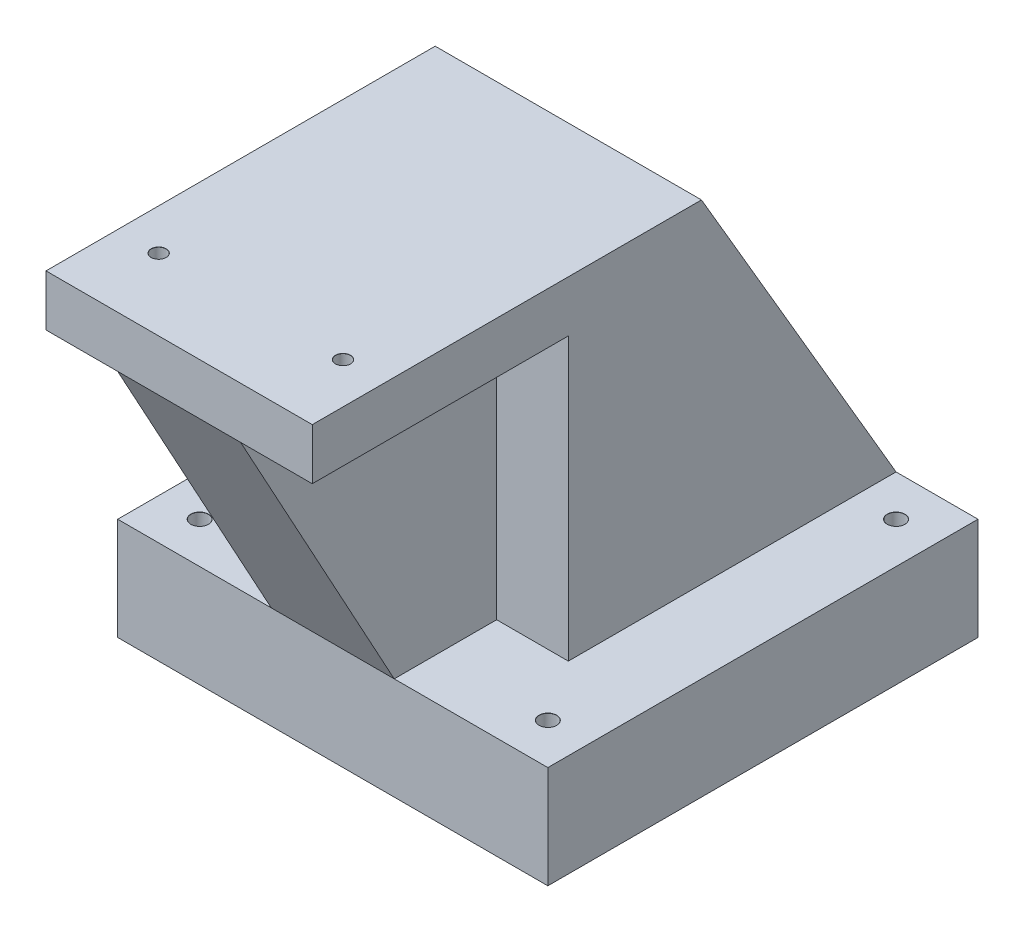
ISO-10303-21;
HEADER;
FILE_DESCRIPTION(('STEP AP214'),'2;1');
FILE_NAME('part.step','',(''),(''),'','','');
FILE_SCHEMA(('AUTOMOTIVE_DESIGN { 1 0 10303 214 1 1 1 1 }'));
ENDSEC;
DATA;
#1=APPLICATION_CONTEXT('core data for automotive mechanical design processes');
#2=APPLICATION_PROTOCOL_DEFINITION('international standard','automotive_design',2000,#1);
#3=PRODUCT_CONTEXT('',#1,'mechanical');
#4=PRODUCT('Part','Part','',(#3));
#5=PRODUCT_RELATED_PRODUCT_CATEGORY('part','',(#4));
#6=PRODUCT_DEFINITION_FORMATION('','',#4);
#7=PRODUCT_DEFINITION_CONTEXT('part definition',#1,'design');
#8=PRODUCT_DEFINITION('design','',#6,#7);
#9=PRODUCT_DEFINITION_SHAPE('','',#8);
#10=(LENGTH_UNIT() NAMED_UNIT(*) SI_UNIT(.MILLI.,.METRE.));
#11=(NAMED_UNIT(*) PLANE_ANGLE_UNIT() SI_UNIT($,.RADIAN.));
#12=(NAMED_UNIT(*) SI_UNIT($,.STERADIAN.) SOLID_ANGLE_UNIT());
#13=UNCERTAINTY_MEASURE_WITH_UNIT(LENGTH_MEASURE(1.E-05),#10,'distance_accuracy_value','');
#14=(GEOMETRIC_REPRESENTATION_CONTEXT(3) GLOBAL_UNCERTAINTY_ASSIGNED_CONTEXT((#13)) GLOBAL_UNIT_ASSIGNED_CONTEXT((#10,
#11,#12)) REPRESENTATION_CONTEXT('',''));
#15=CARTESIAN_POINT('',(0.,0.,0.));
#16=DIRECTION('',(0.,0.,1.));
#17=DIRECTION('',(1.,0.,0.));
#18=AXIS2_PLACEMENT_3D('',#15,#16,#17);
#19=CARTESIAN_POINT('',(0.,20.,0.));
#20=DIRECTION('',(0.,1.,0.));
#21=DIRECTION('',(0.,0.,1.));
#22=AXIS2_PLACEMENT_3D('',#19,#20,#21);
#23=PLANE('',#22);
#24=DIRECTION('',(0.,0.,1.));
#25=VECTOR('',#24,1.);
#26=CARTESIAN_POINT('',(-42.,20.,-42.));
#27=LINE('',#26,#25);
#28=CARTESIAN_POINT('',(-42.,20.,-42.));
#29=VERTEX_POINT('',#28);
#30=CARTESIAN_POINT('',(-42.,20.,42.));
#31=VERTEX_POINT('',#30);
#32=EDGE_CURVE('E237',#29,#31,#27,.T.);
#33=ORIENTED_EDGE('',*,*,#32,.T.);
#34=DIRECTION('',(1.,0.,0.));
#35=VECTOR('',#34,1.);
#36=CARTESIAN_POINT('',(-42.,20.,42.));
#37=LINE('',#36,#35);
#38=CARTESIAN_POINT('',(-12.,20.,42.));
#39=VERTEX_POINT('',#38);
#40=EDGE_CURVE('E105',#31,#39,#37,.T.);
#41=ORIENTED_EDGE('',*,*,#40,.T.);
#42=DIRECTION('',(0.,0.,1.));
#43=VECTOR('',#42,1.);
#44=CARTESIAN_POINT('',(-12.,20.,22.));
#45=LINE('',#44,#43);
#46=CARTESIAN_POINT('',(-12.,20.,22.));
#47=VERTEX_POINT('',#46);
#48=EDGE_CURVE('E171',#47,#39,#45,.T.);
#49=ORIENTED_EDGE('',*,*,#48,.F.);
#50=DIRECTION('',(1.,0.,0.));
#51=VECTOR('',#50,1.);
#52=CARTESIAN_POINT('',(-42.,20.,22.));
#53=LINE('',#52,#51);
#54=CARTESIAN_POINT('',(-26.,20.,22.));
#55=VERTEX_POINT('',#54);
#56=EDGE_CURVE('E161',#55,#47,#53,.T.);
#57=ORIENTED_EDGE('',*,*,#56,.F.);
#58=DIRECTION('',(0.,0.,1.));
#59=VECTOR('',#58,1.);
#60=CARTESIAN_POINT('',(-26.,20.,-4.));
#61=LINE('',#60,#59);
#62=CARTESIAN_POINT('',(-26.,20.,-42.));
#63=VERTEX_POINT('',#62);
#64=EDGE_CURVE('E202',#63,#55,#61,.T.);
#65=ORIENTED_EDGE('',*,*,#64,.F.);
#66=DIRECTION('',(-1.,0.,0.));
#67=VECTOR('',#66,1.);
#68=CARTESIAN_POINT('',(-42.,20.,-42.));
#69=LINE('',#68,#67);
#70=EDGE_CURVE('E64',#63,#29,#69,.T.);
#71=ORIENTED_EDGE('',*,*,#70,.T.);
#72=EDGE_LOOP('',(#33,#41,#49,#57,#65,#71));
#73=FACE_BOUND('',#72,.T.);
#74=CARTESIAN_POINT('',(-34.,20.,-34.));
#75=DIRECTION('',(0.,1.,0.));
#76=DIRECTION('',(0.,0.,1.));
#77=AXIS2_PLACEMENT_3D('',#74,#75,#76);
#78=CIRCLE('',#77,1.725);
#79=CARTESIAN_POINT('',(-34.,20.,-32.275));
#80=VERTEX_POINT('',#79);
#81=EDGE_CURVE('E201',#80,#80,#78,.T.);
#82=ORIENTED_EDGE('',*,*,#81,.F.);
#83=EDGE_LOOP('',(#82));
#84=FACE_BOUND('',#83,.T.);
#85=CARTESIAN_POINT('',(-34.,20.,34.));
#86=DIRECTION('',(0.,1.,0.));
#87=DIRECTION('',(0.,0.,1.));
#88=AXIS2_PLACEMENT_3D('',#85,#86,#87);
#89=CIRCLE('',#88,1.725);
#90=CARTESIAN_POINT('',(-34.,20.,35.725));
#91=VERTEX_POINT('',#90);
#92=EDGE_CURVE('E184',#91,#91,#89,.T.);
#93=ORIENTED_EDGE('',*,*,#92,.F.);
#94=EDGE_LOOP('',(#93));
#95=FACE_BOUND('',#94,.T.);
#96=ADVANCED_FACE('F40',(#73,#84,#95),#23,.T.);
#97=CARTESIAN_POINT('',(42.,20.,-42.));
#98=DIRECTION('',(-1.,0.,0.));
#99=DIRECTION('',(0.,0.,1.));
#100=AXIS2_PLACEMENT_3D('',#97,#98,#99);
#101=PLANE('',#100);
#102=DIRECTION('',(0.,0.,-1.));
#103=VECTOR('',#102,1.);
#104=CARTESIAN_POINT('',(42.,20.,-42.));
#105=LINE('',#104,#103);
#106=CARTESIAN_POINT('',(42.,20.,42.));
#107=VERTEX_POINT('',#106);
#108=CARTESIAN_POINT('',(42.,20.,-42.));
#109=VERTEX_POINT('',#108);
#110=EDGE_CURVE('E96',#107,#109,#105,.T.);
#111=ORIENTED_EDGE('',*,*,#110,.F.);
#112=DIRECTION('',(0.,-1.,0.));
#113=VECTOR('',#112,1.);
#114=CARTESIAN_POINT('',(42.,20.,42.));
#115=LINE('',#114,#113);
#116=CARTESIAN_POINT('',(42.,0.,42.));
#117=VERTEX_POINT('',#116);
#118=EDGE_CURVE('E89',#107,#117,#115,.T.);
#119=ORIENTED_EDGE('',*,*,#118,.T.);
#120=DIRECTION('',(0.,0.,-1.));
#121=VECTOR('',#120,1.);
#122=CARTESIAN_POINT('',(42.,0.,-42.));
#123=LINE('',#122,#121);
#124=CARTESIAN_POINT('',(42.,0.,-42.));
#125=VERTEX_POINT('',#124);
#126=EDGE_CURVE('E103',#117,#125,#123,.T.);
#127=ORIENTED_EDGE('',*,*,#126,.T.);
#128=DIRECTION('',(0.,-1.,0.));
#129=VECTOR('',#128,1.);
#130=CARTESIAN_POINT('',(42.,20.,-42.));
#131=LINE('',#130,#129);
#132=EDGE_CURVE('E124',#109,#125,#131,.T.);
#133=ORIENTED_EDGE('',*,*,#132,.F.);
#134=EDGE_LOOP('',(#111,#119,#127,#133));
#135=FACE_BOUND('',#134,.T.);
#136=ADVANCED_FACE('F42',(#135),#101,.F.);
#137=CARTESIAN_POINT('',(-42.,20.,-42.));
#138=DIRECTION('',(0.,0.,1.));
#139=DIRECTION('',(1.,0.,0.));
#140=AXIS2_PLACEMENT_3D('',#137,#138,#139);
#141=PLANE('',#140);
#142=ORIENTED_EDGE('',*,*,#70,.F.);
#143=DIRECTION('',(1.,0.,0.));
#144=VECTOR('',#143,1.);
#145=CARTESIAN_POINT('',(-204.,20.,-42.));
#146=LINE('',#145,#144);
#147=CARTESIAN_POINT('',(26.,20.,-42.));
#148=VERTEX_POINT('',#147);
#149=EDGE_CURVE('E326',#63,#148,#146,.T.);
#150=ORIENTED_EDGE('',*,*,#149,.T.);
#151=EDGE_CURVE('E236',#109,#148,#69,.T.);
#152=ORIENTED_EDGE('',*,*,#151,.F.);
#153=ORIENTED_EDGE('',*,*,#132,.T.);
#154=DIRECTION('',(-1.,0.,0.));
#155=VECTOR('',#154,1.);
#156=CARTESIAN_POINT('',(-42.,0.,-42.));
#157=LINE('',#156,#155);
#158=CARTESIAN_POINT('',(-42.,0.,-42.));
#159=VERTEX_POINT('',#158);
#160=EDGE_CURVE('E108',#125,#159,#157,.T.);
#161=ORIENTED_EDGE('',*,*,#160,.T.);
#162=DIRECTION('',(0.,-1.,0.));
#163=VECTOR('',#162,1.);
#164=CARTESIAN_POINT('',(-42.,20.,-42.));
#165=LINE('',#164,#163);
#166=EDGE_CURVE('E121',#29,#159,#165,.T.);
#167=ORIENTED_EDGE('',*,*,#166,.F.);
#168=EDGE_LOOP('',(#142,#150,#152,#153,#161,#167));
#169=FACE_BOUND('',#168,.T.);
#170=ADVANCED_FACE('F375',(#169),#141,.F.);
#171=CARTESIAN_POINT('',(-42.,20.,-42.));
#172=DIRECTION('',(1.,0.,0.));
#173=DIRECTION('',(0.,0.,-1.));
#174=AXIS2_PLACEMENT_3D('',#171,#172,#173);
#175=PLANE('',#174);
#176=DIRECTION('',(0.,-1.,0.));
#177=VECTOR('',#176,1.);
#178=CARTESIAN_POINT('',(-42.,20.,42.));
#179=LINE('',#178,#177);
#180=CARTESIAN_POINT('',(-42.,0.,42.));
#181=VERTEX_POINT('',#180);
#182=EDGE_CURVE('E92',#31,#181,#179,.T.);
#183=ORIENTED_EDGE('',*,*,#182,.F.);
#184=ORIENTED_EDGE('',*,*,#32,.F.);
#185=ORIENTED_EDGE('',*,*,#166,.T.);
#186=DIRECTION('',(0.,0.,1.));
#187=VECTOR('',#186,1.);
#188=CARTESIAN_POINT('',(-42.,0.,-42.));
#189=LINE('',#188,#187);
#190=EDGE_CURVE('E97',#159,#181,#189,.T.);
#191=ORIENTED_EDGE('',*,*,#190,.T.);
#192=EDGE_LOOP('',(#183,#184,#185,#191));
#193=FACE_BOUND('',#192,.T.);
#194=ADVANCED_FACE('F385',(#193),#175,.F.);
#195=CARTESIAN_POINT('',(-42.,20.,42.));
#196=DIRECTION('',(0.,0.,-1.));
#197=DIRECTION('',(-1.,0.,0.));
#198=AXIS2_PLACEMENT_3D('',#195,#196,#197);
#199=PLANE('',#198);
#200=DIRECTION('',(1.,0.,0.));
#201=VECTOR('',#200,1.);
#202=CARTESIAN_POINT('',(-42.,0.,42.));
#203=LINE('',#202,#201);
#204=EDGE_CURVE('E85',#181,#117,#203,.T.);
#205=ORIENTED_EDGE('',*,*,#204,.T.);
#206=ORIENTED_EDGE('',*,*,#118,.F.);
#207=CARTESIAN_POINT('',(12.,20.,42.));
#208=VERTEX_POINT('',#207);
#209=EDGE_CURVE('E238',#208,#107,#37,.T.);
#210=ORIENTED_EDGE('',*,*,#209,.F.);
#211=EDGE_CURVE('E242',#39,#208,#37,.T.);
#212=ORIENTED_EDGE('',*,*,#211,.F.);
#213=ORIENTED_EDGE('',*,*,#40,.F.);
#214=ORIENTED_EDGE('',*,*,#182,.T.);
#215=EDGE_LOOP('',(#205,#206,#210,#212,#213,#214));
#216=FACE_BOUND('',#215,.T.);
#217=ADVANCED_FACE('F87',(#216),#199,.F.);
#218=DIRECTION('',(0.,0.,-1.));
#219=VECTOR('',#218,1.);
#220=CARTESIAN_POINT('',(26.,20.,-4.));
#221=LINE('',#220,#219);
#222=CARTESIAN_POINT('',(26.,20.,22.));
#223=VERTEX_POINT('',#222);
#224=EDGE_CURVE('E55',#223,#148,#221,.T.);
#225=ORIENTED_EDGE('',*,*,#224,.F.);
#226=DIRECTION('',(1.,0.,0.));
#227=VECTOR('',#226,1.);
#228=CARTESIAN_POINT('',(42.,20.,22.));
#229=LINE('',#228,#227);
#230=CARTESIAN_POINT('',(12.,20.,22.));
#231=VERTEX_POINT('',#230);
#232=EDGE_CURVE('E140',#231,#223,#229,.T.);
#233=ORIENTED_EDGE('',*,*,#232,.F.);
#234=DIRECTION('',(0.,0.,1.));
#235=VECTOR('',#234,1.);
#236=CARTESIAN_POINT('',(12.,20.,22.));
#237=LINE('',#236,#235);
#238=EDGE_CURVE('E149',#231,#208,#237,.T.);
#239=ORIENTED_EDGE('',*,*,#238,.T.);
#240=ORIENTED_EDGE('',*,*,#209,.T.);
#241=ORIENTED_EDGE('',*,*,#110,.T.);
#242=ORIENTED_EDGE('',*,*,#151,.T.);
#243=EDGE_LOOP('',(#225,#233,#239,#240,#241,#242));
#244=FACE_BOUND('',#243,.T.);
#245=CARTESIAN_POINT('',(34.,20.,-34.));
#246=DIRECTION('',(0.,1.,0.));
#247=DIRECTION('',(0.,0.,1.));
#248=AXIS2_PLACEMENT_3D('',#245,#246,#247);
#249=CIRCLE('',#248,1.725);
#250=CARTESIAN_POINT('',(34.,20.,-32.275));
#251=VERTEX_POINT('',#250);
#252=EDGE_CURVE('E214',#251,#251,#249,.T.);
#253=ORIENTED_EDGE('',*,*,#252,.F.);
#254=EDGE_LOOP('',(#253));
#255=FACE_BOUND('',#254,.T.);
#256=CARTESIAN_POINT('',(34.,20.,34.));
#257=DIRECTION('',(0.,1.,0.));
#258=DIRECTION('',(0.,0.,1.));
#259=AXIS2_PLACEMENT_3D('',#256,#257,#258);
#260=CIRCLE('',#259,1.725);
#261=CARTESIAN_POINT('',(34.,20.,35.725));
#262=VERTEX_POINT('',#261);
#263=EDGE_CURVE('E189',#262,#262,#260,.T.);
#264=ORIENTED_EDGE('',*,*,#263,.F.);
#265=EDGE_LOOP('',(#264));
#266=FACE_BOUND('',#265,.T.);
#267=ADVANCED_FACE('F346',(#244,#255,#266),#23,.T.);
#268=CARTESIAN_POINT('',(0.,0.,0.));
#269=DIRECTION('',(0.,1.,0.));
#270=DIRECTION('',(0.,0.,1.));
#271=AXIS2_PLACEMENT_3D('',#268,#269,#270);
#272=PLANE('',#271);
#273=CARTESIAN_POINT('',(-34.,0.,-34.));
#274=DIRECTION('',(0.,1.,0.));
#275=DIRECTION('',(0.,0.,1.));
#276=AXIS2_PLACEMENT_3D('',#273,#274,#275);
#277=CIRCLE('',#276,1.69999999999999);
#278=CARTESIAN_POINT('',(-34.,0.,-32.3));
#279=VERTEX_POINT('',#278);
#280=EDGE_CURVE('E211',#279,#279,#277,.T.);
#281=ORIENTED_EDGE('',*,*,#280,.T.);
#282=EDGE_LOOP('',(#281));
#283=FACE_BOUND('',#282,.T.);
#284=CARTESIAN_POINT('',(34.,0.,-34.));
#285=DIRECTION('',(0.,1.,0.));
#286=DIRECTION('',(0.,0.,1.));
#287=AXIS2_PLACEMENT_3D('',#284,#285,#286);
#288=CIRCLE('',#287,1.69999999999999);
#289=CARTESIAN_POINT('',(34.,0.,-32.3));
#290=VERTEX_POINT('',#289);
#291=EDGE_CURVE('E220',#290,#290,#288,.T.);
#292=ORIENTED_EDGE('',*,*,#291,.T.);
#293=EDGE_LOOP('',(#292));
#294=FACE_BOUND('',#293,.T.);
#295=CARTESIAN_POINT('',(34.,0.,34.));
#296=DIRECTION('',(0.,1.,0.));
#297=DIRECTION('',(0.,0.,1.));
#298=AXIS2_PLACEMENT_3D('',#295,#296,#297);
#299=CIRCLE('',#298,1.69999999999999);
#300=CARTESIAN_POINT('',(34.,0.,35.7));
#301=VERTEX_POINT('',#300);
#302=EDGE_CURVE('E228',#301,#301,#299,.T.);
#303=ORIENTED_EDGE('',*,*,#302,.T.);
#304=EDGE_LOOP('',(#303));
#305=FACE_BOUND('',#304,.T.);
#306=CARTESIAN_POINT('',(-34.,0.,34.));
#307=DIRECTION('',(0.,1.,0.));
#308=DIRECTION('',(0.,0.,1.));
#309=AXIS2_PLACEMENT_3D('',#306,#307,#308);
#310=CIRCLE('',#309,1.69999999999999);
#311=CARTESIAN_POINT('',(-34.,0.,35.7));
#312=VERTEX_POINT('',#311);
#313=EDGE_CURVE('E110',#312,#312,#310,.T.);
#314=ORIENTED_EDGE('',*,*,#313,.T.);
#315=EDGE_LOOP('',(#314));
#316=FACE_BOUND('',#315,.T.);
#317=ORIENTED_EDGE('',*,*,#126,.F.);
#318=ORIENTED_EDGE('',*,*,#204,.F.);
#319=ORIENTED_EDGE('',*,*,#190,.F.);
#320=ORIENTED_EDGE('',*,*,#160,.F.);
#321=EDGE_LOOP('',(#317,#318,#319,#320));
#322=FACE_BOUND('',#321,.T.);
#323=ADVANCED_FACE('F107',(#283,#294,#305,#316,#322),#272,.F.);
#324=CARTESIAN_POINT('',(-34.,20.,34.));
#325=DIRECTION('',(0.,1.,0.));
#326=DIRECTION('',(0.,0.,1.));
#327=AXIS2_PLACEMENT_3D('',#324,#325,#326);
#328=CYLINDRICAL_SURFACE('',#327,1.69999999999999);
#329=ORIENTED_EDGE('',*,*,#313,.F.);
#330=EDGE_LOOP('',(#329));
#331=FACE_BOUND('',#330,.T.);
#332=CARTESIAN_POINT('',(-34.,19.975,34.));
#333=DIRECTION('',(0.,1.,0.));
#334=DIRECTION('',(0.,0.,1.));
#335=AXIS2_PLACEMENT_3D('',#332,#333,#334);
#336=CIRCLE('',#335,1.69999999999999);
#337=CARTESIAN_POINT('',(-34.,19.975,35.7));
#338=VERTEX_POINT('',#337);
#339=EDGE_CURVE('E114',#338,#338,#336,.T.);
#340=ORIENTED_EDGE('',*,*,#339,.T.);
#341=EDGE_LOOP('',(#340));
#342=FACE_BOUND('',#341,.T.);
#343=ADVANCED_FACE('F378',(#331,#342),#328,.F.);
#344=CARTESIAN_POINT('',(-34.,20.,34.));
#345=DIRECTION('',(0.,1.,0.));
#346=DIRECTION('',(0.,0.,1.));
#347=AXIS2_PLACEMENT_3D('',#344,#345,#346);
#348=CONICAL_SURFACE('',#347,1.725,0.785398163397101);
#349=ORIENTED_EDGE('',*,*,#339,.F.);
#350=EDGE_LOOP('',(#349));
#351=FACE_BOUND('',#350,.T.);
#352=ORIENTED_EDGE('',*,*,#92,.T.);
#353=EDGE_LOOP('',(#352));
#354=FACE_BOUND('',#353,.T.);
#355=ADVANCED_FACE('F367',(#351,#354),#348,.F.);
#356=CARTESIAN_POINT('',(34.,20.,34.));
#357=DIRECTION('',(0.,1.,0.));
#358=DIRECTION('',(0.,0.,1.));
#359=AXIS2_PLACEMENT_3D('',#356,#357,#358);
#360=CYLINDRICAL_SURFACE('',#359,1.69999999999999);
#361=ORIENTED_EDGE('',*,*,#302,.F.);
#362=EDGE_LOOP('',(#361));
#363=FACE_BOUND('',#362,.T.);
#364=CARTESIAN_POINT('',(34.,19.975,34.));
#365=DIRECTION('',(0.,1.,0.));
#366=DIRECTION('',(0.,0.,1.));
#367=AXIS2_PLACEMENT_3D('',#364,#365,#366);
#368=CIRCLE('',#367,1.69999999999999);
#369=CARTESIAN_POINT('',(34.,19.975,35.7));
#370=VERTEX_POINT('',#369);
#371=EDGE_CURVE('E223',#370,#370,#368,.T.);
#372=ORIENTED_EDGE('',*,*,#371,.T.);
#373=EDGE_LOOP('',(#372));
#374=FACE_BOUND('',#373,.T.);
#375=ADVANCED_FACE('F357',(#363,#374),#360,.F.);
#376=CARTESIAN_POINT('',(34.,20.,34.));
#377=DIRECTION('',(0.,1.,0.));
#378=DIRECTION('',(0.,0.,1.));
#379=AXIS2_PLACEMENT_3D('',#376,#377,#378);
#380=CONICAL_SURFACE('',#379,1.725,0.785398163397101);
#381=ORIENTED_EDGE('',*,*,#371,.F.);
#382=EDGE_LOOP('',(#381));
#383=FACE_BOUND('',#382,.T.);
#384=ORIENTED_EDGE('',*,*,#263,.T.);
#385=EDGE_LOOP('',(#384));
#386=FACE_BOUND('',#385,.T.);
#387=ADVANCED_FACE('F354',(#383,#386),#380,.F.);
#388=CARTESIAN_POINT('',(34.,20.,-34.));
#389=DIRECTION('',(0.,1.,0.));
#390=DIRECTION('',(0.,0.,1.));
#391=AXIS2_PLACEMENT_3D('',#388,#389,#390);
#392=CYLINDRICAL_SURFACE('',#391,1.69999999999999);
#393=ORIENTED_EDGE('',*,*,#291,.F.);
#394=EDGE_LOOP('',(#393));
#395=FACE_BOUND('',#394,.T.);
#396=CARTESIAN_POINT('',(34.,19.975,-34.));
#397=DIRECTION('',(0.,1.,0.));
#398=DIRECTION('',(0.,0.,1.));
#399=AXIS2_PLACEMENT_3D('',#396,#397,#398);
#400=CIRCLE('',#399,1.69999999999999);
#401=CARTESIAN_POINT('',(34.,19.975,-32.3));
#402=VERTEX_POINT('',#401);
#403=EDGE_CURVE('E217',#402,#402,#400,.T.);
#404=ORIENTED_EDGE('',*,*,#403,.T.);
#405=EDGE_LOOP('',(#404));
#406=FACE_BOUND('',#405,.T.);
#407=ADVANCED_FACE('F356',(#395,#406),#392,.F.);
#408=CARTESIAN_POINT('',(34.,20.,-34.));
#409=DIRECTION('',(0.,1.,0.));
#410=DIRECTION('',(0.,0.,1.));
#411=AXIS2_PLACEMENT_3D('',#408,#409,#410);
#412=CONICAL_SURFACE('',#411,1.725,0.78539816339724);
#413=ORIENTED_EDGE('',*,*,#403,.F.);
#414=EDGE_LOOP('',(#413));
#415=FACE_BOUND('',#414,.T.);
#416=ORIENTED_EDGE('',*,*,#252,.T.);
#417=EDGE_LOOP('',(#416));
#418=FACE_BOUND('',#417,.T.);
#419=ADVANCED_FACE('F364',(#415,#418),#412,.F.);
#420=CARTESIAN_POINT('',(-34.,20.,-34.));
#421=DIRECTION('',(0.,1.,0.));
#422=DIRECTION('',(0.,0.,1.));
#423=AXIS2_PLACEMENT_3D('',#420,#421,#422);
#424=CYLINDRICAL_SURFACE('',#423,1.69999999999999);
#425=ORIENTED_EDGE('',*,*,#280,.F.);
#426=EDGE_LOOP('',(#425));
#427=FACE_BOUND('',#426,.T.);
#428=CARTESIAN_POINT('',(-34.,19.975,-34.));
#429=DIRECTION('',(0.,1.,0.));
#430=DIRECTION('',(0.,0.,1.));
#431=AXIS2_PLACEMENT_3D('',#428,#429,#430);
#432=CIRCLE('',#431,1.69999999999999);
#433=CARTESIAN_POINT('',(-34.,19.975,-32.3));
#434=VERTEX_POINT('',#433);
#435=EDGE_CURVE('E208',#434,#434,#432,.T.);
#436=ORIENTED_EDGE('',*,*,#435,.T.);
#437=EDGE_LOOP('',(#436));
#438=FACE_BOUND('',#437,.T.);
#439=ADVANCED_FACE('F425',(#427,#438),#424,.F.);
#440=CARTESIAN_POINT('',(-34.,20.,-34.));
#441=DIRECTION('',(0.,1.,0.));
#442=DIRECTION('',(0.,0.,1.));
#443=AXIS2_PLACEMENT_3D('',#440,#441,#442);
#444=CONICAL_SURFACE('',#443,1.725,0.78539816339724);
#445=ORIENTED_EDGE('',*,*,#435,.F.);
#446=EDGE_LOOP('',(#445));
#447=FACE_BOUND('',#446,.T.);
#448=ORIENTED_EDGE('',*,*,#81,.T.);
#449=EDGE_LOOP('',(#448));
#450=FACE_BOUND('',#449,.T.);
#451=ADVANCED_FACE('F416',(#447,#450),#444,.F.);
#452=CARTESIAN_POINT('',(0.,85.,0.));
#453=DIRECTION('',(0.,1.,0.));
#454=DIRECTION('',(0.,0.,1.));
#455=AXIS2_PLACEMENT_3D('',#452,#453,#454);
#456=PLANE('',#455);
#457=DIRECTION('',(0.,0.,-1.));
#458=VECTOR('',#457,1.);
#459=CARTESIAN_POINT('',(26.,85.,226.));
#460=LINE('',#459,#458);
#461=CARTESIAN_POINT('',(26.,85.,72.));
#462=VERTEX_POINT('',#461);
#463=CARTESIAN_POINT('',(26.,85.,-4.));
#464=VERTEX_POINT('',#463);
#465=EDGE_CURVE('E309',#462,#464,#460,.T.);
#466=ORIENTED_EDGE('',*,*,#465,.T.);
#467=DIRECTION('',(1.,0.,0.));
#468=VECTOR('',#467,1.);
#469=CARTESIAN_POINT('',(-204.,85.,-4.));
#470=LINE('',#469,#468);
#471=CARTESIAN_POINT('',(-26.,85.,-4.));
#472=VERTEX_POINT('',#471);
#473=EDGE_CURVE('E314',#472,#464,#470,.T.);
#474=ORIENTED_EDGE('',*,*,#473,.F.);
#475=DIRECTION('',(0.,0.,-1.));
#476=VECTOR('',#475,1.);
#477=CARTESIAN_POINT('',(-26.,85.,226.));
#478=LINE('',#477,#476);
#479=CARTESIAN_POINT('',(-26.,85.,72.));
#480=VERTEX_POINT('',#479);
#481=EDGE_CURVE('E317',#480,#472,#478,.T.);
#482=ORIENTED_EDGE('',*,*,#481,.F.);
#483=DIRECTION('',(1.,0.,0.));
#484=VECTOR('',#483,1.);
#485=CARTESIAN_POINT('',(-42.,85.,72.));
#486=LINE('',#485,#484);
#487=EDGE_CURVE('E198',#480,#462,#486,.T.);
#488=ORIENTED_EDGE('',*,*,#487,.T.);
#489=EDGE_LOOP('',(#466,#474,#482,#488));
#490=FACE_BOUND('',#489,.T.);
#491=CARTESIAN_POINT('',(-18.,85.,58.));
#492=DIRECTION('',(0.,1.,0.));
#493=DIRECTION('',(0.,0.,1.));
#494=AXIS2_PLACEMENT_3D('',#491,#492,#493);
#495=CIRCLE('',#494,1.475);
#496=CARTESIAN_POINT('',(-18.,85.,59.475));
#497=VERTEX_POINT('',#496);
#498=EDGE_CURVE('E185',#497,#497,#495,.T.);
#499=ORIENTED_EDGE('',*,*,#498,.F.);
#500=EDGE_LOOP('',(#499));
#501=FACE_BOUND('',#500,.T.);
#502=CARTESIAN_POINT('',(18.,85.,58.));
#503=DIRECTION('',(0.,1.,0.));
#504=DIRECTION('',(0.,0.,1.));
#505=AXIS2_PLACEMENT_3D('',#502,#503,#504);
#506=CIRCLE('',#505,1.475);
#507=CARTESIAN_POINT('',(18.,85.,59.475));
#508=VERTEX_POINT('',#507);
#509=EDGE_CURVE('E192',#508,#508,#506,.T.);
#510=ORIENTED_EDGE('',*,*,#509,.F.);
#511=EDGE_LOOP('',(#510));
#512=FACE_BOUND('',#511,.T.);
#513=ADVANCED_FACE('F311',(#490,#501,#512),#456,.T.);
#514=CARTESIAN_POINT('',(-42.,85.,72.));
#515=DIRECTION('',(0.,0.,-1.));
#516=DIRECTION('',(-1.,0.,0.));
#517=AXIS2_PLACEMENT_3D('',#514,#515,#516);
#518=PLANE('',#517);
#519=DIRECTION('',(-1.,0.,0.));
#520=VECTOR('',#519,1.);
#521=CARTESIAN_POINT('',(42.,75.,72.));
#522=LINE('',#521,#520);
#523=CARTESIAN_POINT('',(26.,75.,72.));
#524=VERTEX_POINT('',#523);
#525=CARTESIAN_POINT('',(12.,75.,72.));
#526=VERTEX_POINT('',#525);
#527=EDGE_CURVE('E155',#524,#526,#522,.T.);
#528=ORIENTED_EDGE('',*,*,#527,.F.);
#529=DIRECTION('',(0.,1.,0.));
#530=VECTOR('',#529,1.);
#531=CARTESIAN_POINT('',(26.,85.,72.));
#532=LINE('',#531,#530);
#533=EDGE_CURVE('E403',#524,#462,#532,.T.);
#534=ORIENTED_EDGE('',*,*,#533,.T.);
#535=ORIENTED_EDGE('',*,*,#487,.F.);
#536=DIRECTION('',(0.,-1.,0.));
#537=VECTOR('',#536,1.);
#538=CARTESIAN_POINT('',(-26.,85.,72.));
#539=LINE('',#538,#537);
#540=CARTESIAN_POINT('',(-26.,75.,72.));
#541=VERTEX_POINT('',#540);
#542=EDGE_CURVE('E328',#480,#541,#539,.T.);
#543=ORIENTED_EDGE('',*,*,#542,.T.);
#544=DIRECTION('',(-1.,0.,0.));
#545=VECTOR('',#544,1.);
#546=CARTESIAN_POINT('',(-42.,75.,72.));
#547=LINE('',#546,#545);
#548=CARTESIAN_POINT('',(-12.,75.,72.));
#549=VERTEX_POINT('',#548);
#550=EDGE_CURVE('E165',#549,#541,#547,.T.);
#551=ORIENTED_EDGE('',*,*,#550,.F.);
#552=DIRECTION('',(1.,0.,0.));
#553=VECTOR('',#552,1.);
#554=CARTESIAN_POINT('',(-42.,75.,72.));
#555=LINE('',#554,#553);
#556=EDGE_CURVE('E263',#549,#526,#555,.T.);
#557=ORIENTED_EDGE('',*,*,#556,.T.);
#558=EDGE_LOOP('',(#528,#534,#535,#543,#551,#557));
#559=FACE_BOUND('',#558,.T.);
#560=ADVANCED_FACE('F408',(#559),#518,.F.);
#561=CARTESIAN_POINT('',(-26.,85.,-4.));
#562=DIRECTION('',(1.,0.,0.));
#563=DIRECTION('',(0.,0.,-1.));
#564=AXIS2_PLACEMENT_3D('',#561,#562,#563);
#565=PLANE('',#564);
#566=ORIENTED_EDGE('',*,*,#64,.T.);
#567=DIRECTION('',(0.,-1.,0.));
#568=VECTOR('',#567,1.);
#569=CARTESIAN_POINT('',(-26.,0.,22.));
#570=LINE('',#569,#568);
#571=CARTESIAN_POINT('',(-26.,75.,22.));
#572=VERTEX_POINT('',#571);
#573=EDGE_CURVE('E11',#572,#55,#570,.T.);
#574=ORIENTED_EDGE('',*,*,#573,.F.);
#575=DIRECTION('',(0.,0.,-1.));
#576=VECTOR('',#575,1.);
#577=CARTESIAN_POINT('',(-26.,75.,22.));
#578=LINE('',#577,#576);
#579=EDGE_CURVE('E331',#541,#572,#578,.T.);
#580=ORIENTED_EDGE('',*,*,#579,.F.);
#581=ORIENTED_EDGE('',*,*,#542,.F.);
#582=ORIENTED_EDGE('',*,*,#481,.T.);
#583=DIRECTION('',(0.,-0.863296794119082,-0.504696587331156));
#584=VECTOR('',#583,1.);
#585=CARTESIAN_POINT('',(-26.,85.,-4.));
#586=LINE('',#585,#584);
#587=EDGE_CURVE('E325',#472,#63,#586,.T.);
#588=ORIENTED_EDGE('',*,*,#587,.T.);
#589=EDGE_LOOP('',(#566,#574,#580,#581,#582,#588));
#590=FACE_BOUND('',#589,.T.);
#591=ADVANCED_FACE('F394',(#590),#565,.F.);
#592=CARTESIAN_POINT('',(26.,85.,-4.));
#593=DIRECTION('',(-1.,0.,0.));
#594=DIRECTION('',(0.,0.,1.));
#595=AXIS2_PLACEMENT_3D('',#592,#593,#594);
#596=PLANE('',#595);
#597=ORIENTED_EDGE('',*,*,#224,.T.);
#598=DIRECTION('',(0.,-0.863296794119082,-0.504696587331156));
#599=VECTOR('',#598,1.);
#600=CARTESIAN_POINT('',(26.,85.,-4.));
#601=LINE('',#600,#599);
#602=EDGE_CURVE('E322',#464,#148,#601,.T.);
#603=ORIENTED_EDGE('',*,*,#602,.F.);
#604=ORIENTED_EDGE('',*,*,#465,.F.);
#605=ORIENTED_EDGE('',*,*,#533,.F.);
#606=DIRECTION('',(0.,0.,1.));
#607=VECTOR('',#606,1.);
#608=CARTESIAN_POINT('',(26.,75.,22.));
#609=LINE('',#608,#607);
#610=CARTESIAN_POINT('',(26.,75.,22.));
#611=VERTEX_POINT('',#610);
#612=EDGE_CURVE('E135',#611,#524,#609,.T.);
#613=ORIENTED_EDGE('',*,*,#612,.F.);
#614=DIRECTION('',(0.,-1.,0.));
#615=VECTOR('',#614,1.);
#616=CARTESIAN_POINT('',(26.,0.,22.));
#617=LINE('',#616,#615);
#618=EDGE_CURVE('E48',#611,#223,#617,.T.);
#619=ORIENTED_EDGE('',*,*,#618,.T.);
#620=EDGE_LOOP('',(#597,#603,#604,#605,#613,#619));
#621=FACE_BOUND('',#620,.T.);
#622=ADVANCED_FACE('F129',(#621),#596,.F.);
#623=CARTESIAN_POINT('',(18.,85.,58.));
#624=DIRECTION('',(0.,1.,0.));
#625=DIRECTION('',(0.,0.,1.));
#626=AXIS2_PLACEMENT_3D('',#623,#624,#625);
#627=CYLINDRICAL_SURFACE('',#626,1.44999999999999);
#628=CARTESIAN_POINT('',(18.,75.,58.));
#629=DIRECTION('',(0.,1.,0.));
#630=DIRECTION('',(0.,0.,1.));
#631=AXIS2_PLACEMENT_3D('',#628,#629,#630);
#632=CIRCLE('',#631,1.44999999999999);
#633=CARTESIAN_POINT('',(18.,75.,59.45));
#634=VERTEX_POINT('',#633);
#635=EDGE_CURVE('E181',#634,#634,#632,.F.);
#636=ORIENTED_EDGE('',*,*,#635,.T.);
#637=EDGE_LOOP('',(#636));
#638=FACE_BOUND('',#637,.T.);
#639=CARTESIAN_POINT('',(18.,84.975,58.));
#640=DIRECTION('',(0.,1.,0.));
#641=DIRECTION('',(0.,0.,1.));
#642=AXIS2_PLACEMENT_3D('',#639,#640,#641);
#643=CIRCLE('',#642,1.45);
#644=CARTESIAN_POINT('',(18.,84.975,59.45));
#645=VERTEX_POINT('',#644);
#646=EDGE_CURVE('E195',#645,#645,#643,.T.);
#647=ORIENTED_EDGE('',*,*,#646,.T.);
#648=EDGE_LOOP('',(#647));
#649=FACE_BOUND('',#648,.T.);
#650=ADVANCED_FACE('F422',(#638,#649),#627,.F.);
#651=CARTESIAN_POINT('',(18.,85.,58.));
#652=DIRECTION('',(0.,1.,0.));
#653=DIRECTION('',(0.,0.,1.));
#654=AXIS2_PLACEMENT_3D('',#651,#652,#653);
#655=CONICAL_SURFACE('',#654,1.475,0.785398163397518);
#656=ORIENTED_EDGE('',*,*,#646,.F.);
#657=EDGE_LOOP('',(#656));
#658=FACE_BOUND('',#657,.T.);
#659=ORIENTED_EDGE('',*,*,#509,.T.);
#660=EDGE_LOOP('',(#659));
#661=FACE_BOUND('',#660,.T.);
#662=ADVANCED_FACE('F657',(#658,#661),#655,.F.);
#663=CARTESIAN_POINT('',(-18.,85.,58.));
#664=DIRECTION('',(0.,1.,0.));
#665=DIRECTION('',(0.,0.,1.));
#666=AXIS2_PLACEMENT_3D('',#663,#664,#665);
#667=CYLINDRICAL_SURFACE('',#666,1.44999999999999);
#668=CARTESIAN_POINT('',(-18.,75.,58.));
#669=DIRECTION('',(0.,1.,0.));
#670=DIRECTION('',(0.,0.,1.));
#671=AXIS2_PLACEMENT_3D('',#668,#669,#670);
#672=CIRCLE('',#671,1.44999999999999);
#673=CARTESIAN_POINT('',(-18.,75.,59.45));
#674=VERTEX_POINT('',#673);
#675=EDGE_CURVE('E159',#674,#674,#672,.F.);
#676=ORIENTED_EDGE('',*,*,#675,.T.);
#677=EDGE_LOOP('',(#676));
#678=FACE_BOUND('',#677,.T.);
#679=CARTESIAN_POINT('',(-18.,84.975,58.));
#680=DIRECTION('',(0.,1.,0.));
#681=DIRECTION('',(0.,0.,1.));
#682=AXIS2_PLACEMENT_3D('',#679,#680,#681);
#683=CIRCLE('',#682,1.45);
#684=CARTESIAN_POINT('',(-18.,84.975,59.45));
#685=VERTEX_POINT('',#684);
#686=EDGE_CURVE('E188',#685,#685,#683,.T.);
#687=ORIENTED_EDGE('',*,*,#686,.T.);
#688=EDGE_LOOP('',(#687));
#689=FACE_BOUND('',#688,.T.);
#690=ADVANCED_FACE('F647',(#678,#689),#667,.F.);
#691=CARTESIAN_POINT('',(-18.,85.,58.));
#692=DIRECTION('',(0.,1.,0.));
#693=DIRECTION('',(0.,0.,1.));
#694=AXIS2_PLACEMENT_3D('',#691,#692,#693);
#695=CONICAL_SURFACE('',#694,1.475,0.785398163397518);
#696=ORIENTED_EDGE('',*,*,#686,.F.);
#697=EDGE_LOOP('',(#696));
#698=FACE_BOUND('',#697,.T.);
#699=ORIENTED_EDGE('',*,*,#498,.T.);
#700=EDGE_LOOP('',(#699));
#701=FACE_BOUND('',#700,.T.);
#702=ADVANCED_FACE('F485',(#698,#701),#695,.F.);
#703=CARTESIAN_POINT('',(-42.,75.,22.));
#704=DIRECTION('',(0.,1.,0.));
#705=DIRECTION('',(0.,0.,1.));
#706=AXIS2_PLACEMENT_3D('',#703,#704,#705);
#707=PLANE('',#706);
#708=ORIENTED_EDGE('',*,*,#550,.T.);
#709=ORIENTED_EDGE('',*,*,#579,.T.);
#710=DIRECTION('',(-1.,0.,0.));
#711=VECTOR('',#710,1.);
#712=CARTESIAN_POINT('',(-42.,75.,22.));
#713=LINE('',#712,#711);
#714=CARTESIAN_POINT('',(-12.,75.,22.));
#715=VERTEX_POINT('',#714);
#716=EDGE_CURVE('E168',#715,#572,#713,.T.);
#717=ORIENTED_EDGE('',*,*,#716,.F.);
#718=DIRECTION('',(0.,0.,1.));
#719=VECTOR('',#718,1.);
#720=CARTESIAN_POINT('',(-12.,75.,22.));
#721=LINE('',#720,#719);
#722=EDGE_CURVE('E158',#715,#549,#721,.T.);
#723=ORIENTED_EDGE('',*,*,#722,.T.);
#724=EDGE_LOOP('',(#708,#709,#717,#723));
#725=FACE_BOUND('',#724,.T.);
#726=ORIENTED_EDGE('',*,*,#675,.F.);
#727=EDGE_LOOP('',(#726));
#728=FACE_BOUND('',#727,.T.);
#729=ADVANCED_FACE('F400',(#725,#728),#707,.F.);
#730=CARTESIAN_POINT('',(-12.,20.,22.));
#731=DIRECTION('',(1.,0.,0.));
#732=DIRECTION('',(0.,0.,-1.));
#733=AXIS2_PLACEMENT_3D('',#730,#731,#732);
#734=PLANE('',#733);
#735=ORIENTED_EDGE('',*,*,#48,.T.);
#736=DIRECTION('',(0.,0.877895572914384,0.478852130680573));
#737=VECTOR('',#736,1.);
#738=CARTESIAN_POINT('',(-12.,11.5923566878981,37.4140127388535));
#739=LINE('',#738,#737);
#740=EDGE_CURVE('E174',#39,#549,#739,.T.);
#741=ORIENTED_EDGE('',*,*,#740,.T.);
#742=ORIENTED_EDGE('',*,*,#722,.F.);
#743=DIRECTION('',(0.,1.,0.));
#744=VECTOR('',#743,1.);
#745=CARTESIAN_POINT('',(-12.,20.,22.));
#746=LINE('',#745,#744);
#747=EDGE_CURVE('E164',#47,#715,#746,.T.);
#748=ORIENTED_EDGE('',*,*,#747,.F.);
#749=EDGE_LOOP('',(#735,#741,#742,#748));
#750=FACE_BOUND('',#749,.T.);
#751=ADVANCED_FACE('F267',(#750),#734,.F.);
#752=CARTESIAN_POINT('',(0.,0.,22.));
#753=DIRECTION('',(0.,0.,-1.));
#754=DIRECTION('',(-1.,0.,0.));
#755=AXIS2_PLACEMENT_3D('',#752,#753,#754);
#756=PLANE('',#755);
#757=ORIENTED_EDGE('',*,*,#716,.T.);
#758=ORIENTED_EDGE('',*,*,#573,.T.);
#759=ORIENTED_EDGE('',*,*,#56,.T.);
#760=ORIENTED_EDGE('',*,*,#747,.T.);
#761=EDGE_LOOP('',(#757,#758,#759,#760));
#762=FACE_BOUND('',#761,.T.);
#763=ADVANCED_FACE('F396',(#762),#756,.F.);
#764=CARTESIAN_POINT('',(42.,75.,22.));
#765=DIRECTION('',(0.,1.,0.));
#766=DIRECTION('',(0.,0.,1.));
#767=AXIS2_PLACEMENT_3D('',#764,#765,#766);
#768=PLANE('',#767);
#769=DIRECTION('',(-1.,0.,0.));
#770=VECTOR('',#769,1.);
#771=CARTESIAN_POINT('',(42.,75.,22.));
#772=LINE('',#771,#770);
#773=CARTESIAN_POINT('',(12.,75.,22.));
#774=VERTEX_POINT('',#773);
#775=EDGE_CURVE('E151',#611,#774,#772,.T.);
#776=ORIENTED_EDGE('',*,*,#775,.F.);
#777=ORIENTED_EDGE('',*,*,#612,.T.);
#778=ORIENTED_EDGE('',*,*,#527,.T.);
#779=DIRECTION('',(0.,0.,1.));
#780=VECTOR('',#779,1.);
#781=CARTESIAN_POINT('',(12.,75.,22.));
#782=LINE('',#781,#780);
#783=EDGE_CURVE('E146',#774,#526,#782,.T.);
#784=ORIENTED_EDGE('',*,*,#783,.F.);
#785=EDGE_LOOP('',(#776,#777,#778,#784));
#786=FACE_BOUND('',#785,.T.);
#787=ORIENTED_EDGE('',*,*,#635,.F.);
#788=EDGE_LOOP('',(#787));
#789=FACE_BOUND('',#788,.T.);
#790=ADVANCED_FACE('F341',(#786,#789),#768,.F.);
#791=CARTESIAN_POINT('',(12.,20.,22.));
#792=DIRECTION('',(-1.,0.,0.));
#793=DIRECTION('',(0.,0.,1.));
#794=AXIS2_PLACEMENT_3D('',#791,#792,#793);
#795=PLANE('',#794);
#796=ORIENTED_EDGE('',*,*,#783,.T.);
#797=DIRECTION('',(0.,0.877895572914384,0.478852130680573));
#798=VECTOR('',#797,1.);
#799=CARTESIAN_POINT('',(12.,20.,42.));
#800=LINE('',#799,#798);
#801=EDGE_CURVE('E337',#208,#526,#800,.T.);
#802=ORIENTED_EDGE('',*,*,#801,.F.);
#803=ORIENTED_EDGE('',*,*,#238,.F.);
#804=DIRECTION('',(0.,-1.,0.));
#805=VECTOR('',#804,1.);
#806=CARTESIAN_POINT('',(12.,20.,22.));
#807=LINE('',#806,#805);
#808=EDGE_CURVE('E144',#774,#231,#807,.T.);
#809=ORIENTED_EDGE('',*,*,#808,.F.);
#810=EDGE_LOOP('',(#796,#802,#803,#809));
#811=FACE_BOUND('',#810,.T.);
#812=ADVANCED_FACE('F345',(#811),#795,.F.);
#813=CARTESIAN_POINT('',(0.,0.,22.));
#814=DIRECTION('',(0.,0.,1.));
#815=DIRECTION('',(1.,0.,0.));
#816=AXIS2_PLACEMENT_3D('',#813,#814,#815);
#817=PLANE('',#816);
#818=ORIENTED_EDGE('',*,*,#618,.F.);
#819=ORIENTED_EDGE('',*,*,#775,.T.);
#820=ORIENTED_EDGE('',*,*,#808,.T.);
#821=ORIENTED_EDGE('',*,*,#232,.T.);
#822=EDGE_LOOP('',(#818,#819,#820,#821));
#823=FACE_BOUND('',#822,.T.);
#824=ADVANCED_FACE('F141',(#823),#817,.T.);
#825=CARTESIAN_POINT('',(-42.,20.,42.));
#826=DIRECTION('',(0.,0.478852130680573,-0.877895572914384));
#827=DIRECTION('',(0.,0.877895572914384,0.478852130680573));
#828=AXIS2_PLACEMENT_3D('',#825,#826,#827);
#829=PLANE('',#828);
#830=ORIENTED_EDGE('',*,*,#211,.T.);
#831=ORIENTED_EDGE('',*,*,#801,.T.);
#832=ORIENTED_EDGE('',*,*,#556,.F.);
#833=ORIENTED_EDGE('',*,*,#740,.F.);
#834=EDGE_LOOP('',(#830,#831,#832,#833));
#835=FACE_BOUND('',#834,.T.);
#836=ADVANCED_FACE('F258',(#835),#829,.F.);
#837=CARTESIAN_POINT('',(-204.,85.,-4.));
#838=DIRECTION('',(0.,-0.504696587331156,0.863296794119082));
#839=DIRECTION('',(0.,-0.863296794119082,-0.504696587331156));
#840=AXIS2_PLACEMENT_3D('',#837,#838,#839);
#841=PLANE('',#840);
#842=ORIENTED_EDGE('',*,*,#473,.T.);
#843=ORIENTED_EDGE('',*,*,#602,.T.);
#844=ORIENTED_EDGE('',*,*,#149,.F.);
#845=ORIENTED_EDGE('',*,*,#587,.F.);
#846=EDGE_LOOP('',(#842,#843,#844,#845));
#847=FACE_BOUND('',#846,.T.);
#848=ADVANCED_FACE('F321',(#847),#841,.F.);
#849=CLOSED_SHELL('',(#96,#136,#170,#194,#217,#267,#323,#343,#355,#375,#387,#407,#419,#439,#451,
#513,#560,#591,#622,#650,#662,#690,#702,#729,#751,#763,#790,#812,#824,#836,#848));
#850=MANIFOLD_SOLID_BREP('B2',#849);
#851=ADVANCED_BREP_SHAPE_REPRESENTATION('',(#18,#850),#14);
#852=SHAPE_DEFINITION_REPRESENTATION(#9,#851);
ENDSEC;
END-ISO-10303-21;
